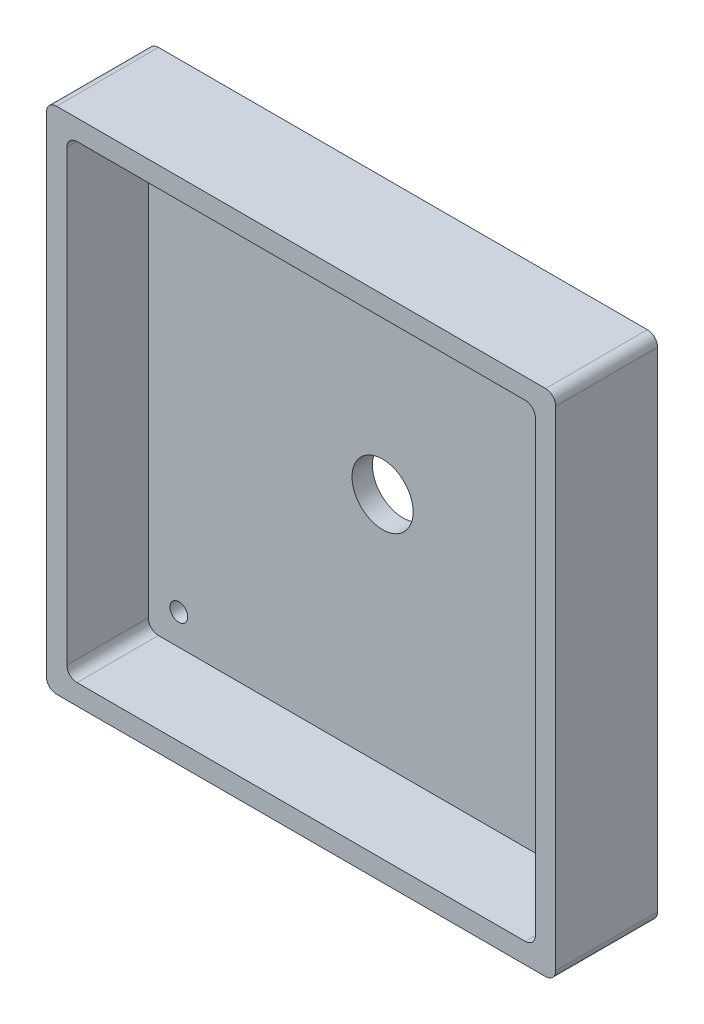
ISO-10303-21;
HEADER;
FILE_DESCRIPTION(('STEP AP214'),'2;1');
FILE_NAME('part.step','',(''),(''),'','','');
FILE_SCHEMA(('AUTOMOTIVE_DESIGN { 1 0 10303 214 1 1 1 1 }'));
ENDSEC;
DATA;
#1=APPLICATION_CONTEXT('core data for automotive mechanical design processes');
#2=APPLICATION_PROTOCOL_DEFINITION('international standard','automotive_design',2000,#1);
#3=PRODUCT_CONTEXT('',#1,'mechanical');
#4=PRODUCT('Part','Part','',(#3));
#5=PRODUCT_RELATED_PRODUCT_CATEGORY('part','',(#4));
#6=PRODUCT_DEFINITION_FORMATION('','',#4);
#7=PRODUCT_DEFINITION_CONTEXT('part definition',#1,'design');
#8=PRODUCT_DEFINITION('design','',#6,#7);
#9=PRODUCT_DEFINITION_SHAPE('','',#8);
#10=(LENGTH_UNIT() NAMED_UNIT(*) SI_UNIT(.MILLI.,.METRE.));
#11=(NAMED_UNIT(*) PLANE_ANGLE_UNIT() SI_UNIT($,.RADIAN.));
#12=(NAMED_UNIT(*) SI_UNIT($,.STERADIAN.) SOLID_ANGLE_UNIT());
#13=UNCERTAINTY_MEASURE_WITH_UNIT(LENGTH_MEASURE(1.E-05),#10,'distance_accuracy_value','');
#14=(GEOMETRIC_REPRESENTATION_CONTEXT(3) GLOBAL_UNCERTAINTY_ASSIGNED_CONTEXT((#13)) GLOBAL_UNIT_ASSIGNED_CONTEXT((#10,
#11,#12)) REPRESENTATION_CONTEXT('',''));
#15=CARTESIAN_POINT('',(0.,0.,0.));
#16=DIRECTION('',(0.,0.,1.));
#17=DIRECTION('',(1.,0.,0.));
#18=AXIS2_PLACEMENT_3D('',#15,#16,#17);
#19=CARTESIAN_POINT('',(-50.,50.,20.));
#20=DIRECTION('',(1.,0.,0.));
#21=DIRECTION('',(0.,1.,0.));
#22=AXIS2_PLACEMENT_3D('',#19,#20,#21);
#23=PLANE('',#22);
#24=DIRECTION('',(0.,-1.,0.));
#25=VECTOR('',#24,1.);
#26=CARTESIAN_POINT('',(-50.,50.,0.));
#27=LINE('',#26,#25);
#28=CARTESIAN_POINT('',(-50.,48.,0.));
#29=VERTEX_POINT('',#28);
#30=CARTESIAN_POINT('',(-50.,-48.,0.));
#31=VERTEX_POINT('',#30);
#32=EDGE_CURVE('E206',#29,#31,#27,.T.);
#33=ORIENTED_EDGE('',*,*,#32,.T.);
#34=DIRECTION('',(0.,0.,-1.));
#35=VECTOR('',#34,1.);
#36=CARTESIAN_POINT('',(-50.,-48.,20.));
#37=LINE('',#36,#35);
#38=CARTESIAN_POINT('',(-50.,-48.,20.));
#39=VERTEX_POINT('',#38);
#40=EDGE_CURVE('E266',#31,#39,#37,.F.);
#41=ORIENTED_EDGE('',*,*,#40,.T.);
#42=DIRECTION('',(0.,-1.,0.));
#43=VECTOR('',#42,1.);
#44=CARTESIAN_POINT('',(-50.,50.,20.));
#45=LINE('',#44,#43);
#46=CARTESIAN_POINT('',(-50.,48.,20.));
#47=VERTEX_POINT('',#46);
#48=EDGE_CURVE('E195',#47,#39,#45,.T.);
#49=ORIENTED_EDGE('',*,*,#48,.F.);
#50=DIRECTION('',(0.,0.,-1.));
#51=VECTOR('',#50,1.);
#52=CARTESIAN_POINT('',(-50.,48.,20.));
#53=LINE('',#52,#51);
#54=EDGE_CURVE('E263',#47,#29,#53,.T.);
#55=ORIENTED_EDGE('',*,*,#54,.T.);
#56=EDGE_LOOP('',(#33,#41,#49,#55));
#57=FACE_BOUND('',#56,.T.);
#58=ADVANCED_FACE('F39',(#57),#23,.F.);
#59=CARTESIAN_POINT('',(50.,-50.,20.));
#60=DIRECTION('',(0.,1.,0.));
#61=DIRECTION('',(-1.,0.,0.));
#62=AXIS2_PLACEMENT_3D('',#59,#60,#61);
#63=PLANE('',#62);
#64=DIRECTION('',(1.,0.,0.));
#65=VECTOR('',#64,1.);
#66=CARTESIAN_POINT('',(50.,-50.,0.));
#67=LINE('',#66,#65);
#68=CARTESIAN_POINT('',(-48.,-50.,0.));
#69=VERTEX_POINT('',#68);
#70=CARTESIAN_POINT('',(48.,-50.,0.));
#71=VERTEX_POINT('',#70);
#72=EDGE_CURVE('E209',#69,#71,#67,.T.);
#73=ORIENTED_EDGE('',*,*,#72,.T.);
#74=DIRECTION('',(0.,0.,-1.));
#75=VECTOR('',#74,1.);
#76=CARTESIAN_POINT('',(48.,-50.,20.));
#77=LINE('',#76,#75);
#78=CARTESIAN_POINT('',(48.,-50.,20.));
#79=VERTEX_POINT('',#78);
#80=EDGE_CURVE('E254',#71,#79,#77,.F.);
#81=ORIENTED_EDGE('',*,*,#80,.T.);
#82=DIRECTION('',(1.,0.,0.));
#83=VECTOR('',#82,1.);
#84=CARTESIAN_POINT('',(50.,-50.,20.));
#85=LINE('',#84,#83);
#86=CARTESIAN_POINT('',(-48.,-50.,20.));
#87=VERTEX_POINT('',#86);
#88=EDGE_CURVE('E198',#87,#79,#85,.T.);
#89=ORIENTED_EDGE('',*,*,#88,.F.);
#90=DIRECTION('',(0.,0.,-1.));
#91=VECTOR('',#90,1.);
#92=CARTESIAN_POINT('',(-48.,-50.,20.));
#93=LINE('',#92,#91);
#94=EDGE_CURVE('E251',#87,#69,#93,.T.);
#95=ORIENTED_EDGE('',*,*,#94,.T.);
#96=EDGE_LOOP('',(#73,#81,#89,#95));
#97=FACE_BOUND('',#96,.T.);
#98=ADVANCED_FACE('F354',(#97),#63,.F.);
#99=CARTESIAN_POINT('',(50.,50.,20.));
#100=DIRECTION('',(-1.,0.,0.));
#101=DIRECTION('',(0.,-1.,0.));
#102=AXIS2_PLACEMENT_3D('',#99,#100,#101);
#103=PLANE('',#102);
#104=DIRECTION('',(0.,1.,0.));
#105=VECTOR('',#104,1.);
#106=CARTESIAN_POINT('',(50.,50.,20.));
#107=LINE('',#106,#105);
#108=CARTESIAN_POINT('',(50.,-48.,20.));
#109=VERTEX_POINT('',#108);
#110=CARTESIAN_POINT('',(50.,48.,20.));
#111=VERTEX_POINT('',#110);
#112=EDGE_CURVE('E202',#109,#111,#107,.T.);
#113=ORIENTED_EDGE('',*,*,#112,.F.);
#114=DIRECTION('',(0.,0.,-1.));
#115=VECTOR('',#114,1.);
#116=CARTESIAN_POINT('',(50.,-48.,20.));
#117=LINE('',#116,#115);
#118=CARTESIAN_POINT('',(50.,-48.,0.));
#119=VERTEX_POINT('',#118);
#120=EDGE_CURVE('E240',#109,#119,#117,.T.);
#121=ORIENTED_EDGE('',*,*,#120,.T.);
#122=DIRECTION('',(0.,1.,0.));
#123=VECTOR('',#122,1.);
#124=CARTESIAN_POINT('',(50.,50.,0.));
#125=LINE('',#124,#123);
#126=CARTESIAN_POINT('',(50.,48.,0.));
#127=VERTEX_POINT('',#126);
#128=EDGE_CURVE('E212',#119,#127,#125,.T.);
#129=ORIENTED_EDGE('',*,*,#128,.T.);
#130=DIRECTION('',(0.,0.,-1.));
#131=VECTOR('',#130,1.);
#132=CARTESIAN_POINT('',(50.,48.,20.));
#133=LINE('',#132,#131);
#134=EDGE_CURVE('E238',#127,#111,#133,.F.);
#135=ORIENTED_EDGE('',*,*,#134,.T.);
#136=EDGE_LOOP('',(#113,#121,#129,#135));
#137=FACE_BOUND('',#136,.T.);
#138=ADVANCED_FACE('F360',(#137),#103,.F.);
#139=CARTESIAN_POINT('',(50.,50.,20.));
#140=DIRECTION('',(0.,-1.,0.));
#141=DIRECTION('',(1.,0.,0.));
#142=AXIS2_PLACEMENT_3D('',#139,#140,#141);
#143=PLANE('',#142);
#144=DIRECTION('',(-1.,0.,0.));
#145=VECTOR('',#144,1.);
#146=CARTESIAN_POINT('',(50.,50.,0.));
#147=LINE('',#146,#145);
#148=CARTESIAN_POINT('',(48.,50.,0.));
#149=VERTEX_POINT('',#148);
#150=CARTESIAN_POINT('',(-48.,50.,0.));
#151=VERTEX_POINT('',#150);
#152=EDGE_CURVE('E199',#149,#151,#147,.T.);
#153=ORIENTED_EDGE('',*,*,#152,.T.);
#154=DIRECTION('',(0.,0.,-1.));
#155=VECTOR('',#154,1.);
#156=CARTESIAN_POINT('',(-48.,50.,20.));
#157=LINE('',#156,#155);
#158=CARTESIAN_POINT('',(-48.,50.,20.));
#159=VERTEX_POINT('',#158);
#160=EDGE_CURVE('E56',#151,#159,#157,.F.);
#161=ORIENTED_EDGE('',*,*,#160,.T.);
#162=DIRECTION('',(-1.,0.,0.));
#163=VECTOR('',#162,1.);
#164=CARTESIAN_POINT('',(50.,50.,20.));
#165=LINE('',#164,#163);
#166=CARTESIAN_POINT('',(48.,50.,20.));
#167=VERTEX_POINT('',#166);
#168=EDGE_CURVE('E204',#167,#159,#165,.T.);
#169=ORIENTED_EDGE('',*,*,#168,.F.);
#170=DIRECTION('',(0.,0.,-1.));
#171=VECTOR('',#170,1.);
#172=CARTESIAN_POINT('',(48.,50.,20.));
#173=LINE('',#172,#171);
#174=EDGE_CURVE('E268',#167,#149,#173,.T.);
#175=ORIENTED_EDGE('',*,*,#174,.T.);
#176=EDGE_LOOP('',(#153,#161,#169,#175));
#177=FACE_BOUND('',#176,.T.);
#178=ADVANCED_FACE('F551',(#177),#143,.F.);
#179=CARTESIAN_POINT('',(0.,0.,20.));
#180=DIRECTION('',(0.,0.,-1.));
#181=DIRECTION('',(-1.,0.,0.));
#182=AXIS2_PLACEMENT_3D('',#179,#180,#181);
#183=PLANE('',#182);
#184=DIRECTION('',(1.,0.,0.));
#185=VECTOR('',#184,1.);
#186=CARTESIAN_POINT('',(46.,-46.,20.));
#187=LINE('',#186,#185);
#188=CARTESIAN_POINT('',(-44.,-46.,20.));
#189=VERTEX_POINT('',#188);
#190=CARTESIAN_POINT('',(44.,-46.,20.));
#191=VERTEX_POINT('',#190);
#192=EDGE_CURVE('E180',#189,#191,#187,.T.);
#193=ORIENTED_EDGE('',*,*,#192,.F.);
#194=CARTESIAN_POINT('',(-44.,-44.,20.));
#195=DIRECTION('',(0.,0.,-1.));
#196=DIRECTION('',(-1.,0.,0.));
#197=AXIS2_PLACEMENT_3D('',#194,#195,#196);
#198=CIRCLE('',#197,2.);
#199=CARTESIAN_POINT('',(-46.,-44.,20.));
#200=VERTEX_POINT('',#199);
#201=EDGE_CURVE('E11',#189,#200,#198,.T.);
#202=ORIENTED_EDGE('',*,*,#201,.T.);
#203=DIRECTION('',(0.,-1.,0.));
#204=VECTOR('',#203,1.);
#205=CARTESIAN_POINT('',(-46.,-46.,20.));
#206=LINE('',#205,#204);
#207=CARTESIAN_POINT('',(-46.,44.,20.));
#208=VERTEX_POINT('',#207);
#209=EDGE_CURVE('E171',#208,#200,#206,.T.);
#210=ORIENTED_EDGE('',*,*,#209,.F.);
#211=CARTESIAN_POINT('',(-44.,44.,20.));
#212=DIRECTION('',(0.,0.,-1.));
#213=DIRECTION('',(-1.,0.,0.));
#214=AXIS2_PLACEMENT_3D('',#211,#212,#213);
#215=CIRCLE('',#214,2.);
#216=CARTESIAN_POINT('',(-44.,46.,20.));
#217=VERTEX_POINT('',#216);
#218=EDGE_CURVE('E155',#208,#217,#215,.T.);
#219=ORIENTED_EDGE('',*,*,#218,.T.);
#220=DIRECTION('',(-1.,0.,0.));
#221=VECTOR('',#220,1.);
#222=CARTESIAN_POINT('',(46.,46.,20.));
#223=LINE('',#222,#221);
#224=CARTESIAN_POINT('',(44.,46.,20.));
#225=VERTEX_POINT('',#224);
#226=EDGE_CURVE('E193',#225,#217,#223,.T.);
#227=ORIENTED_EDGE('',*,*,#226,.F.);
#228=CARTESIAN_POINT('',(44.,44.,20.));
#229=DIRECTION('',(0.,0.,-1.));
#230=DIRECTION('',(-1.,0.,0.));
#231=AXIS2_PLACEMENT_3D('',#228,#229,#230);
#232=CIRCLE('',#231,2.);
#233=CARTESIAN_POINT('',(46.,44.,20.));
#234=VERTEX_POINT('',#233);
#235=EDGE_CURVE('E165',#225,#234,#232,.T.);
#236=ORIENTED_EDGE('',*,*,#235,.T.);
#237=DIRECTION('',(0.,1.,0.));
#238=VECTOR('',#237,1.);
#239=CARTESIAN_POINT('',(46.,-46.,20.));
#240=LINE('',#239,#238);
#241=CARTESIAN_POINT('',(46.,-44.,20.));
#242=VERTEX_POINT('',#241);
#243=EDGE_CURVE('E183',#242,#234,#240,.T.);
#244=ORIENTED_EDGE('',*,*,#243,.F.);
#245=CARTESIAN_POINT('',(44.,-44.,20.));
#246=DIRECTION('',(0.,0.,-1.));
#247=DIRECTION('',(-1.,0.,0.));
#248=AXIS2_PLACEMENT_3D('',#245,#246,#247);
#249=CIRCLE('',#248,2.);
#250=EDGE_CURVE('E48',#242,#191,#249,.T.);
#251=ORIENTED_EDGE('',*,*,#250,.T.);
#252=EDGE_LOOP('',(#193,#202,#210,#219,#227,#236,#244,#251));
#253=FACE_BOUND('',#252,.T.);
#254=ORIENTED_EDGE('',*,*,#88,.T.);
#255=CARTESIAN_POINT('',(48.,-48.,20.));
#256=DIRECTION('',(0.,0.,-1.));
#257=DIRECTION('',(-1.,0.,0.));
#258=AXIS2_PLACEMENT_3D('',#255,#256,#257);
#259=CIRCLE('',#258,2.);
#260=EDGE_CURVE('E261',#79,#109,#259,.F.);
#261=ORIENTED_EDGE('',*,*,#260,.T.);
#262=ORIENTED_EDGE('',*,*,#112,.T.);
#263=CARTESIAN_POINT('',(48.,48.,20.));
#264=DIRECTION('',(0.,0.,-1.));
#265=DIRECTION('',(-1.,0.,0.));
#266=AXIS2_PLACEMENT_3D('',#263,#264,#265);
#267=CIRCLE('',#266,2.);
#268=EDGE_CURVE('E63',#111,#167,#267,.F.);
#269=ORIENTED_EDGE('',*,*,#268,.T.);
#270=ORIENTED_EDGE('',*,*,#168,.T.);
#271=CARTESIAN_POINT('',(-48.,48.,20.));
#272=DIRECTION('',(0.,0.,-1.));
#273=DIRECTION('',(-1.,0.,0.));
#274=AXIS2_PLACEMENT_3D('',#271,#272,#273);
#275=CIRCLE('',#274,2.);
#276=EDGE_CURVE('E257',#159,#47,#275,.F.);
#277=ORIENTED_EDGE('',*,*,#276,.T.);
#278=ORIENTED_EDGE('',*,*,#48,.T.);
#279=CARTESIAN_POINT('',(-48.,-48.,20.));
#280=DIRECTION('',(0.,0.,-1.));
#281=DIRECTION('',(-1.,0.,0.));
#282=AXIS2_PLACEMENT_3D('',#279,#280,#281);
#283=CIRCLE('',#282,2.);
#284=EDGE_CURVE('E259',#39,#87,#283,.F.);
#285=ORIENTED_EDGE('',*,*,#284,.T.);
#286=EDGE_LOOP('',(#254,#261,#262,#269,#270,#277,#278,#285));
#287=FACE_BOUND('',#286,.T.);
#288=ADVANCED_FACE('F179',(#253,#287),#183,.F.);
#289=CARTESIAN_POINT('',(0.,0.,0.));
#290=DIRECTION('',(0.,0.,-1.));
#291=DIRECTION('',(-1.,0.,0.));
#292=AXIS2_PLACEMENT_3D('',#289,#290,#291);
#293=PLANE('',#292);
#294=CARTESIAN_POINT('',(-39.9999999999977,-40.,0.));
#295=DIRECTION('',(0.,0.,1.));
#296=DIRECTION('',(1.,0.,0.));
#297=AXIS2_PLACEMENT_3D('',#294,#295,#296);
#298=CIRCLE('',#297,1.75);
#299=CARTESIAN_POINT('',(-38.2499999999977,-40.,0.));
#300=VERTEX_POINT('',#299);
#301=EDGE_CURVE('E300',#300,#300,#298,.T.);
#302=ORIENTED_EDGE('',*,*,#301,.T.);
#303=EDGE_LOOP('',(#302));
#304=FACE_BOUND('',#303,.T.);
#305=CARTESIAN_POINT('',(40.0000000000023,-39.9999999999978,0.));
#306=DIRECTION('',(0.,0.,1.));
#307=DIRECTION('',(1.,0.,0.));
#308=AXIS2_PLACEMENT_3D('',#305,#306,#307);
#309=CIRCLE('',#308,1.75);
#310=CARTESIAN_POINT('',(41.7500000000023,-39.9999999999978,0.));
#311=VERTEX_POINT('',#310);
#312=EDGE_CURVE('E297',#311,#311,#309,.T.);
#313=ORIENTED_EDGE('',*,*,#312,.T.);
#314=EDGE_LOOP('',(#313));
#315=FACE_BOUND('',#314,.T.);
#316=CARTESIAN_POINT('',(40.,40.0000000000023,0.));
#317=DIRECTION('',(0.,0.,1.));
#318=DIRECTION('',(1.,0.,0.));
#319=AXIS2_PLACEMENT_3D('',#316,#317,#318);
#320=CIRCLE('',#319,1.75);
#321=CARTESIAN_POINT('',(41.75,40.0000000000023,0.));
#322=VERTEX_POINT('',#321);
#323=EDGE_CURVE('E299',#322,#322,#320,.T.);
#324=ORIENTED_EDGE('',*,*,#323,.T.);
#325=EDGE_LOOP('',(#324));
#326=FACE_BOUND('',#325,.T.);
#327=CARTESIAN_POINT('',(-40.,40.,0.));
#328=DIRECTION('',(0.,0.,1.));
#329=DIRECTION('',(1.,0.,0.));
#330=AXIS2_PLACEMENT_3D('',#327,#328,#329);
#331=CIRCLE('',#330,1.75);
#332=CARTESIAN_POINT('',(-38.25,40.,0.));
#333=VERTEX_POINT('',#332);
#334=EDGE_CURVE('E303',#333,#333,#331,.T.);
#335=ORIENTED_EDGE('',*,*,#334,.T.);
#336=EDGE_LOOP('',(#335));
#337=FACE_BOUND('',#336,.T.);
#338=CARTESIAN_POINT('',(0.,0.,0.));
#339=DIRECTION('',(0.,0.,1.));
#340=DIRECTION('',(1.,0.,0.));
#341=AXIS2_PLACEMENT_3D('',#338,#339,#340);
#342=CIRCLE('',#341,6.);
#343=CARTESIAN_POINT('',(6.,0.,0.));
#344=VERTEX_POINT('',#343);
#345=EDGE_CURVE('E278',#344,#344,#342,.T.);
#346=ORIENTED_EDGE('',*,*,#345,.T.);
#347=EDGE_LOOP('',(#346));
#348=FACE_BOUND('',#347,.T.);
#349=ORIENTED_EDGE('',*,*,#128,.F.);
#350=CARTESIAN_POINT('',(48.,-48.,0.));
#351=DIRECTION('',(0.,0.,-1.));
#352=DIRECTION('',(-1.,0.,0.));
#353=AXIS2_PLACEMENT_3D('',#350,#351,#352);
#354=CIRCLE('',#353,2.);
#355=EDGE_CURVE('E249',#119,#71,#354,.T.);
#356=ORIENTED_EDGE('',*,*,#355,.T.);
#357=ORIENTED_EDGE('',*,*,#72,.F.);
#358=CARTESIAN_POINT('',(-48.,-48.,0.));
#359=DIRECTION('',(0.,0.,-1.));
#360=DIRECTION('',(-1.,0.,0.));
#361=AXIS2_PLACEMENT_3D('',#358,#359,#360);
#362=CIRCLE('',#361,2.);
#363=EDGE_CURVE('E247',#69,#31,#362,.T.);
#364=ORIENTED_EDGE('',*,*,#363,.T.);
#365=ORIENTED_EDGE('',*,*,#32,.F.);
#366=CARTESIAN_POINT('',(-48.,48.,0.));
#367=DIRECTION('',(0.,0.,-1.));
#368=DIRECTION('',(-1.,0.,0.));
#369=AXIS2_PLACEMENT_3D('',#366,#367,#368);
#370=CIRCLE('',#369,2.);
#371=EDGE_CURVE('E245',#29,#151,#370,.T.);
#372=ORIENTED_EDGE('',*,*,#371,.T.);
#373=ORIENTED_EDGE('',*,*,#152,.F.);
#374=CARTESIAN_POINT('',(48.,48.,0.));
#375=DIRECTION('',(0.,0.,-1.));
#376=DIRECTION('',(-1.,0.,0.));
#377=AXIS2_PLACEMENT_3D('',#374,#375,#376);
#378=CIRCLE('',#377,2.);
#379=EDGE_CURVE('E243',#149,#127,#378,.T.);
#380=ORIENTED_EDGE('',*,*,#379,.T.);
#381=EDGE_LOOP('',(#349,#356,#357,#364,#365,#372,#373,#380));
#382=FACE_BOUND('',#381,.T.);
#383=ADVANCED_FACE('F427',(#304,#315,#326,#337,#348,#382),#293,.T.);
#384=CARTESIAN_POINT('',(-46.,-46.,4.));
#385=DIRECTION('',(-1.,0.,0.));
#386=DIRECTION('',(0.,0.,1.));
#387=AXIS2_PLACEMENT_3D('',#384,#385,#386);
#388=PLANE('',#387);
#389=DIRECTION('',(0.,-1.,0.));
#390=VECTOR('',#389,1.);
#391=CARTESIAN_POINT('',(-46.,-46.,4.));
#392=LINE('',#391,#390);
#393=CARTESIAN_POINT('',(-46.,44.,4.));
#394=VERTEX_POINT('',#393);
#395=CARTESIAN_POINT('',(-46.,-44.,4.));
#396=VERTEX_POINT('',#395);
#397=EDGE_CURVE('E174',#394,#396,#392,.T.);
#398=ORIENTED_EDGE('',*,*,#397,.F.);
#399=DIRECTION('',(0.,0.,1.));
#400=VECTOR('',#399,1.);
#401=CARTESIAN_POINT('',(-46.,44.,20.));
#402=LINE('',#401,#400);
#403=EDGE_CURVE('E159',#394,#208,#402,.T.);
#404=ORIENTED_EDGE('',*,*,#403,.T.);
#405=ORIENTED_EDGE('',*,*,#209,.T.);
#406=DIRECTION('',(0.,0.,1.));
#407=VECTOR('',#406,1.);
#408=CARTESIAN_POINT('',(-46.,-44.,4.));
#409=LINE('',#408,#407);
#410=EDGE_CURVE('E176',#200,#396,#409,.F.);
#411=ORIENTED_EDGE('',*,*,#410,.T.);
#412=EDGE_LOOP('',(#398,#404,#405,#411));
#413=FACE_BOUND('',#412,.T.);
#414=ADVANCED_FACE('F170',(#413),#388,.F.);
#415=CARTESIAN_POINT('',(46.,46.,4.));
#416=DIRECTION('',(0.,1.,0.));
#417=DIRECTION('',(-1.,0.,0.));
#418=AXIS2_PLACEMENT_3D('',#415,#416,#417);
#419=PLANE('',#418);
#420=ORIENTED_EDGE('',*,*,#226,.T.);
#421=DIRECTION('',(0.,0.,1.));
#422=VECTOR('',#421,1.);
#423=CARTESIAN_POINT('',(-44.,46.,4.));
#424=LINE('',#423,#422);
#425=CARTESIAN_POINT('',(-44.,46.,4.));
#426=VERTEX_POINT('',#425);
#427=EDGE_CURVE('E160',#217,#426,#424,.F.);
#428=ORIENTED_EDGE('',*,*,#427,.T.);
#429=DIRECTION('',(-1.,0.,0.));
#430=VECTOR('',#429,1.);
#431=CARTESIAN_POINT('',(46.,46.,4.));
#432=LINE('',#431,#430);
#433=CARTESIAN_POINT('',(44.,46.,4.));
#434=VERTEX_POINT('',#433);
#435=EDGE_CURVE('E188',#434,#426,#432,.T.);
#436=ORIENTED_EDGE('',*,*,#435,.F.);
#437=DIRECTION('',(0.,0.,1.));
#438=VECTOR('',#437,1.);
#439=CARTESIAN_POINT('',(44.,46.,20.));
#440=LINE('',#439,#438);
#441=EDGE_CURVE('E175',#434,#225,#440,.T.);
#442=ORIENTED_EDGE('',*,*,#441,.T.);
#443=EDGE_LOOP('',(#420,#428,#436,#442));
#444=FACE_BOUND('',#443,.T.);
#445=ADVANCED_FACE('F323',(#444),#419,.F.);
#446=CARTESIAN_POINT('',(46.,-46.,4.));
#447=DIRECTION('',(1.,0.,0.));
#448=DIRECTION('',(0.,0.,-1.));
#449=AXIS2_PLACEMENT_3D('',#446,#447,#448);
#450=PLANE('',#449);
#451=ORIENTED_EDGE('',*,*,#243,.T.);
#452=DIRECTION('',(0.,0.,1.));
#453=VECTOR('',#452,1.);
#454=CARTESIAN_POINT('',(46.,44.,4.));
#455=LINE('',#454,#453);
#456=CARTESIAN_POINT('',(46.,44.,4.));
#457=VERTEX_POINT('',#456);
#458=EDGE_CURVE('E231',#234,#457,#455,.F.);
#459=ORIENTED_EDGE('',*,*,#458,.T.);
#460=DIRECTION('',(0.,1.,0.));
#461=VECTOR('',#460,1.);
#462=CARTESIAN_POINT('',(46.,-46.,4.));
#463=LINE('',#462,#461);
#464=CARTESIAN_POINT('',(46.,-44.,4.));
#465=VERTEX_POINT('',#464);
#466=EDGE_CURVE('E314',#465,#457,#463,.T.);
#467=ORIENTED_EDGE('',*,*,#466,.F.);
#468=DIRECTION('',(0.,0.,1.));
#469=VECTOR('',#468,1.);
#470=CARTESIAN_POINT('',(46.,-44.,20.));
#471=LINE('',#470,#469);
#472=EDGE_CURVE('E228',#465,#242,#471,.T.);
#473=ORIENTED_EDGE('',*,*,#472,.T.);
#474=EDGE_LOOP('',(#451,#459,#467,#473));
#475=FACE_BOUND('',#474,.T.);
#476=ADVANCED_FACE('F329',(#475),#450,.F.);
#477=CARTESIAN_POINT('',(46.,-46.,4.));
#478=DIRECTION('',(0.,-1.,0.));
#479=DIRECTION('',(1.,0.,0.));
#480=AXIS2_PLACEMENT_3D('',#477,#478,#479);
#481=PLANE('',#480);
#482=ORIENTED_EDGE('',*,*,#192,.T.);
#483=DIRECTION('',(0.,0.,1.));
#484=VECTOR('',#483,1.);
#485=CARTESIAN_POINT('',(44.,-46.,4.));
#486=LINE('',#485,#484);
#487=CARTESIAN_POINT('',(44.,-46.,4.));
#488=VERTEX_POINT('',#487);
#489=EDGE_CURVE('E236',#191,#488,#486,.F.);
#490=ORIENTED_EDGE('',*,*,#489,.T.);
#491=DIRECTION('',(1.,0.,0.));
#492=VECTOR('',#491,1.);
#493=CARTESIAN_POINT('',(46.,-46.,4.));
#494=LINE('',#493,#492);
#495=CARTESIAN_POINT('',(-44.,-46.,4.));
#496=VERTEX_POINT('',#495);
#497=EDGE_CURVE('E312',#496,#488,#494,.T.);
#498=ORIENTED_EDGE('',*,*,#497,.F.);
#499=DIRECTION('',(0.,0.,1.));
#500=VECTOR('',#499,1.);
#501=CARTESIAN_POINT('',(-44.,-46.,20.));
#502=LINE('',#501,#500);
#503=EDGE_CURVE('E233',#496,#189,#502,.T.);
#504=ORIENTED_EDGE('',*,*,#503,.T.);
#505=EDGE_LOOP('',(#482,#490,#498,#504));
#506=FACE_BOUND('',#505,.T.);
#507=ADVANCED_FACE('F336',(#506),#481,.F.);
#508=CARTESIAN_POINT('',(0.,0.,4.));
#509=DIRECTION('',(0.,0.,1.));
#510=DIRECTION('',(1.,0.,0.));
#511=AXIS2_PLACEMENT_3D('',#508,#509,#510);
#512=PLANE('',#511);
#513=CARTESIAN_POINT('',(-39.9999999999977,-40.,4.));
#514=DIRECTION('',(0.,0.,1.));
#515=DIRECTION('',(1.,0.,0.));
#516=AXIS2_PLACEMENT_3D('',#513,#514,#515);
#517=CIRCLE('',#516,1.75);
#518=CARTESIAN_POINT('',(-38.2499999999977,-40.,4.));
#519=VERTEX_POINT('',#518);
#520=EDGE_CURVE('E43',#519,#519,#517,.F.);
#521=ORIENTED_EDGE('',*,*,#520,.T.);
#522=EDGE_LOOP('',(#521));
#523=FACE_BOUND('',#522,.T.);
#524=CARTESIAN_POINT('',(40.0000000000023,-39.9999999999978,4.));
#525=DIRECTION('',(0.,0.,1.));
#526=DIRECTION('',(1.,0.,0.));
#527=AXIS2_PLACEMENT_3D('',#524,#525,#526);
#528=CIRCLE('',#527,1.75);
#529=CARTESIAN_POINT('',(41.7500000000023,-39.9999999999978,4.));
#530=VERTEX_POINT('',#529);
#531=EDGE_CURVE('E186',#530,#530,#528,.F.);
#532=ORIENTED_EDGE('',*,*,#531,.T.);
#533=EDGE_LOOP('',(#532));
#534=FACE_BOUND('',#533,.T.);
#535=CARTESIAN_POINT('',(40.,40.0000000000023,4.));
#536=DIRECTION('',(0.,0.,1.));
#537=DIRECTION('',(1.,0.,0.));
#538=AXIS2_PLACEMENT_3D('',#535,#536,#537);
#539=CIRCLE('',#538,1.75);
#540=CARTESIAN_POINT('',(41.75,40.0000000000023,4.));
#541=VERTEX_POINT('',#540);
#542=EDGE_CURVE('E281',#541,#541,#539,.F.);
#543=ORIENTED_EDGE('',*,*,#542,.T.);
#544=EDGE_LOOP('',(#543));
#545=FACE_BOUND('',#544,.T.);
#546=CARTESIAN_POINT('',(-40.,40.,4.));
#547=DIRECTION('',(0.,0.,1.));
#548=DIRECTION('',(1.,0.,0.));
#549=AXIS2_PLACEMENT_3D('',#546,#547,#548);
#550=CIRCLE('',#549,1.75);
#551=CARTESIAN_POINT('',(-38.25,40.,4.));
#552=VERTEX_POINT('',#551);
#553=EDGE_CURVE('E277',#552,#552,#550,.F.);
#554=ORIENTED_EDGE('',*,*,#553,.T.);
#555=EDGE_LOOP('',(#554));
#556=FACE_BOUND('',#555,.T.);
#557=CARTESIAN_POINT('',(0.,0.,4.));
#558=DIRECTION('',(0.,0.,1.));
#559=DIRECTION('',(1.,0.,0.));
#560=AXIS2_PLACEMENT_3D('',#557,#558,#559);
#561=CIRCLE('',#560,6.);
#562=CARTESIAN_POINT('',(6.,0.,4.));
#563=VERTEX_POINT('',#562);
#564=EDGE_CURVE('E274',#563,#563,#561,.F.);
#565=ORIENTED_EDGE('',*,*,#564,.T.);
#566=EDGE_LOOP('',(#565));
#567=FACE_BOUND('',#566,.T.);
#568=ORIENTED_EDGE('',*,*,#435,.T.);
#569=CARTESIAN_POINT('',(-44.,44.,4.));
#570=DIRECTION('',(0.,0.,1.));
#571=DIRECTION('',(1.,0.,0.));
#572=AXIS2_PLACEMENT_3D('',#569,#570,#571);
#573=CIRCLE('',#572,2.);
#574=EDGE_CURVE('E226',#426,#394,#573,.T.);
#575=ORIENTED_EDGE('',*,*,#574,.T.);
#576=ORIENTED_EDGE('',*,*,#397,.T.);
#577=CARTESIAN_POINT('',(-44.,-44.,4.));
#578=DIRECTION('',(0.,0.,1.));
#579=DIRECTION('',(1.,0.,0.));
#580=AXIS2_PLACEMENT_3D('',#577,#578,#579);
#581=CIRCLE('',#580,2.);
#582=EDGE_CURVE('E220',#396,#496,#581,.T.);
#583=ORIENTED_EDGE('',*,*,#582,.T.);
#584=ORIENTED_EDGE('',*,*,#497,.T.);
#585=CARTESIAN_POINT('',(44.,-44.,4.));
#586=DIRECTION('',(0.,0.,1.));
#587=DIRECTION('',(1.,0.,0.));
#588=AXIS2_PLACEMENT_3D('',#585,#586,#587);
#589=CIRCLE('',#588,2.);
#590=EDGE_CURVE('E222',#488,#465,#589,.T.);
#591=ORIENTED_EDGE('',*,*,#590,.T.);
#592=ORIENTED_EDGE('',*,*,#466,.T.);
#593=CARTESIAN_POINT('',(44.,44.,4.));
#594=DIRECTION('',(0.,0.,1.));
#595=DIRECTION('',(1.,0.,0.));
#596=AXIS2_PLACEMENT_3D('',#593,#594,#595);
#597=CIRCLE('',#596,2.);
#598=EDGE_CURVE('E224',#457,#434,#597,.T.);
#599=ORIENTED_EDGE('',*,*,#598,.T.);
#600=EDGE_LOOP('',(#568,#575,#576,#583,#584,#591,#592,#599));
#601=FACE_BOUND('',#600,.T.);
#602=ADVANCED_FACE('F286',(#523,#534,#545,#556,#567,#601),#512,.T.);
#603=CARTESIAN_POINT('',(-44.,44.,4.));
#604=DIRECTION('',(0.,0.,-1.));
#605=DIRECTION('',(-1.,0.,0.));
#606=AXIS2_PLACEMENT_3D('',#603,#604,#605);
#607=CYLINDRICAL_SURFACE('',#606,2.);
#608=ORIENTED_EDGE('',*,*,#574,.F.);
#609=ORIENTED_EDGE('',*,*,#427,.F.);
#610=ORIENTED_EDGE('',*,*,#218,.F.);
#611=ORIENTED_EDGE('',*,*,#403,.F.);
#612=EDGE_LOOP('',(#608,#609,#610,#611));
#613=FACE_BOUND('',#612,.T.);
#614=ADVANCED_FACE('F158',(#613),#607,.F.);
#615=CARTESIAN_POINT('',(44.,44.,4.));
#616=DIRECTION('',(0.,0.,-1.));
#617=DIRECTION('',(-1.,0.,0.));
#618=AXIS2_PLACEMENT_3D('',#615,#616,#617);
#619=CYLINDRICAL_SURFACE('',#618,2.);
#620=ORIENTED_EDGE('',*,*,#598,.F.);
#621=ORIENTED_EDGE('',*,*,#458,.F.);
#622=ORIENTED_EDGE('',*,*,#235,.F.);
#623=ORIENTED_EDGE('',*,*,#441,.F.);
#624=EDGE_LOOP('',(#620,#621,#622,#623));
#625=FACE_BOUND('',#624,.T.);
#626=ADVANCED_FACE('F325',(#625),#619,.F.);
#627=CARTESIAN_POINT('',(44.,-44.,4.));
#628=DIRECTION('',(0.,0.,-1.));
#629=DIRECTION('',(-1.,0.,0.));
#630=AXIS2_PLACEMENT_3D('',#627,#628,#629);
#631=CYLINDRICAL_SURFACE('',#630,2.);
#632=ORIENTED_EDGE('',*,*,#590,.F.);
#633=ORIENTED_EDGE('',*,*,#489,.F.);
#634=ORIENTED_EDGE('',*,*,#250,.F.);
#635=ORIENTED_EDGE('',*,*,#472,.F.);
#636=EDGE_LOOP('',(#632,#633,#634,#635));
#637=FACE_BOUND('',#636,.T.);
#638=ADVANCED_FACE('F333',(#637),#631,.F.);
#639=CARTESIAN_POINT('',(-44.,-44.,4.));
#640=DIRECTION('',(0.,0.,-1.));
#641=DIRECTION('',(-1.,0.,0.));
#642=AXIS2_PLACEMENT_3D('',#639,#640,#641);
#643=CYLINDRICAL_SURFACE('',#642,2.);
#644=ORIENTED_EDGE('',*,*,#582,.F.);
#645=ORIENTED_EDGE('',*,*,#410,.F.);
#646=ORIENTED_EDGE('',*,*,#201,.F.);
#647=ORIENTED_EDGE('',*,*,#503,.F.);
#648=EDGE_LOOP('',(#644,#645,#646,#647));
#649=FACE_BOUND('',#648,.T.);
#650=ADVANCED_FACE('F341',(#649),#643,.F.);
#651=CARTESIAN_POINT('',(48.,-48.,20.));
#652=DIRECTION('',(0.,0.,-1.));
#653=DIRECTION('',(-1.,0.,0.));
#654=AXIS2_PLACEMENT_3D('',#651,#652,#653);
#655=CYLINDRICAL_SURFACE('',#654,2.);
#656=ORIENTED_EDGE('',*,*,#260,.F.);
#657=ORIENTED_EDGE('',*,*,#80,.F.);
#658=ORIENTED_EDGE('',*,*,#355,.F.);
#659=ORIENTED_EDGE('',*,*,#120,.F.);
#660=EDGE_LOOP('',(#656,#657,#658,#659));
#661=FACE_BOUND('',#660,.T.);
#662=ADVANCED_FACE('F343',(#661),#655,.T.);
#663=CARTESIAN_POINT('',(-48.,-48.,20.));
#664=DIRECTION('',(0.,0.,-1.));
#665=DIRECTION('',(-1.,0.,0.));
#666=AXIS2_PLACEMENT_3D('',#663,#664,#665);
#667=CYLINDRICAL_SURFACE('',#666,2.);
#668=ORIENTED_EDGE('',*,*,#284,.F.);
#669=ORIENTED_EDGE('',*,*,#40,.F.);
#670=ORIENTED_EDGE('',*,*,#363,.F.);
#671=ORIENTED_EDGE('',*,*,#94,.F.);
#672=EDGE_LOOP('',(#668,#669,#670,#671));
#673=FACE_BOUND('',#672,.T.);
#674=ADVANCED_FACE('F349',(#673),#667,.T.);
#675=CARTESIAN_POINT('',(-48.,48.,20.));
#676=DIRECTION('',(0.,0.,-1.));
#677=DIRECTION('',(-1.,0.,0.));
#678=AXIS2_PLACEMENT_3D('',#675,#676,#677);
#679=CYLINDRICAL_SURFACE('',#678,2.);
#680=ORIENTED_EDGE('',*,*,#276,.F.);
#681=ORIENTED_EDGE('',*,*,#160,.F.);
#682=ORIENTED_EDGE('',*,*,#371,.F.);
#683=ORIENTED_EDGE('',*,*,#54,.F.);
#684=EDGE_LOOP('',(#680,#681,#682,#683));
#685=FACE_BOUND('',#684,.T.);
#686=ADVANCED_FACE('F399',(#685),#679,.T.);
#687=CARTESIAN_POINT('',(48.,48.,20.));
#688=DIRECTION('',(0.,0.,-1.));
#689=DIRECTION('',(-1.,0.,0.));
#690=AXIS2_PLACEMENT_3D('',#687,#688,#689);
#691=CYLINDRICAL_SURFACE('',#690,2.);
#692=ORIENTED_EDGE('',*,*,#268,.F.);
#693=ORIENTED_EDGE('',*,*,#134,.F.);
#694=ORIENTED_EDGE('',*,*,#379,.F.);
#695=ORIENTED_EDGE('',*,*,#174,.F.);
#696=EDGE_LOOP('',(#692,#693,#694,#695));
#697=FACE_BOUND('',#696,.T.);
#698=ADVANCED_FACE('F41',(#697),#691,.T.);
#699=CARTESIAN_POINT('',(0.,0.,16.));
#700=DIRECTION('',(0.,0.,-1.));
#701=DIRECTION('',(-1.,0.,0.));
#702=AXIS2_PLACEMENT_3D('',#699,#700,#701);
#703=CYLINDRICAL_SURFACE('',#702,6.);
#704=ORIENTED_EDGE('',*,*,#564,.F.);
#705=EDGE_LOOP('',(#704));
#706=FACE_BOUND('',#705,.T.);
#707=ORIENTED_EDGE('',*,*,#345,.F.);
#708=EDGE_LOOP('',(#707));
#709=FACE_BOUND('',#708,.T.);
#710=ADVANCED_FACE('F419',(#706,#709),#703,.F.);
#711=CARTESIAN_POINT('',(-40.,40.,16.));
#712=DIRECTION('',(0.,0.,-1.));
#713=DIRECTION('',(-1.,0.,0.));
#714=AXIS2_PLACEMENT_3D('',#711,#712,#713);
#715=CYLINDRICAL_SURFACE('',#714,1.75);
#716=ORIENTED_EDGE('',*,*,#553,.F.);
#717=EDGE_LOOP('',(#716));
#718=FACE_BOUND('',#717,.T.);
#719=ORIENTED_EDGE('',*,*,#334,.F.);
#720=EDGE_LOOP('',(#719));
#721=FACE_BOUND('',#720,.T.);
#722=ADVANCED_FACE('F456',(#718,#721),#715,.F.);
#723=CARTESIAN_POINT('',(40.,40.0000000000023,16.));
#724=DIRECTION('',(0.,0.,-1.));
#725=DIRECTION('',(-1.,0.,0.));
#726=AXIS2_PLACEMENT_3D('',#723,#724,#725);
#727=CYLINDRICAL_SURFACE('',#726,1.75);
#728=ORIENTED_EDGE('',*,*,#542,.F.);
#729=EDGE_LOOP('',(#728));
#730=FACE_BOUND('',#729,.T.);
#731=ORIENTED_EDGE('',*,*,#323,.F.);
#732=EDGE_LOOP('',(#731));
#733=FACE_BOUND('',#732,.T.);
#734=ADVANCED_FACE('F293',(#730,#733),#727,.F.);
#735=CARTESIAN_POINT('',(40.0000000000023,-39.9999999999978,16.));
#736=DIRECTION('',(0.,0.,-1.));
#737=DIRECTION('',(-1.,0.,0.));
#738=AXIS2_PLACEMENT_3D('',#735,#736,#737);
#739=CYLINDRICAL_SURFACE('',#738,1.75);
#740=ORIENTED_EDGE('',*,*,#531,.F.);
#741=EDGE_LOOP('',(#740));
#742=FACE_BOUND('',#741,.T.);
#743=ORIENTED_EDGE('',*,*,#312,.F.);
#744=EDGE_LOOP('',(#743));
#745=FACE_BOUND('',#744,.T.);
#746=ADVANCED_FACE('F289',(#742,#745),#739,.F.);
#747=CARTESIAN_POINT('',(-39.9999999999977,-40.,16.));
#748=DIRECTION('',(0.,0.,-1.));
#749=DIRECTION('',(-1.,0.,0.));
#750=AXIS2_PLACEMENT_3D('',#747,#748,#749);
#751=CYLINDRICAL_SURFACE('',#750,1.75);
#752=ORIENTED_EDGE('',*,*,#520,.F.);
#753=EDGE_LOOP('',(#752));
#754=FACE_BOUND('',#753,.T.);
#755=ORIENTED_EDGE('',*,*,#301,.F.);
#756=EDGE_LOOP('',(#755));
#757=FACE_BOUND('',#756,.T.);
#758=ADVANCED_FACE('F292',(#754,#757),#751,.F.);
#759=CLOSED_SHELL('',(#58,#98,#138,#178,#288,#383,#414,#445,#476,#507,#602,#614,#626,#638,#650,
#662,#674,#686,#698,#710,#722,#734,#746,#758));
#760=MANIFOLD_SOLID_BREP('B2',#759);
#761=ADVANCED_BREP_SHAPE_REPRESENTATION('',(#18,#760),#14);
#762=SHAPE_DEFINITION_REPRESENTATION(#9,#761);
ENDSEC;
END-ISO-10303-21;
